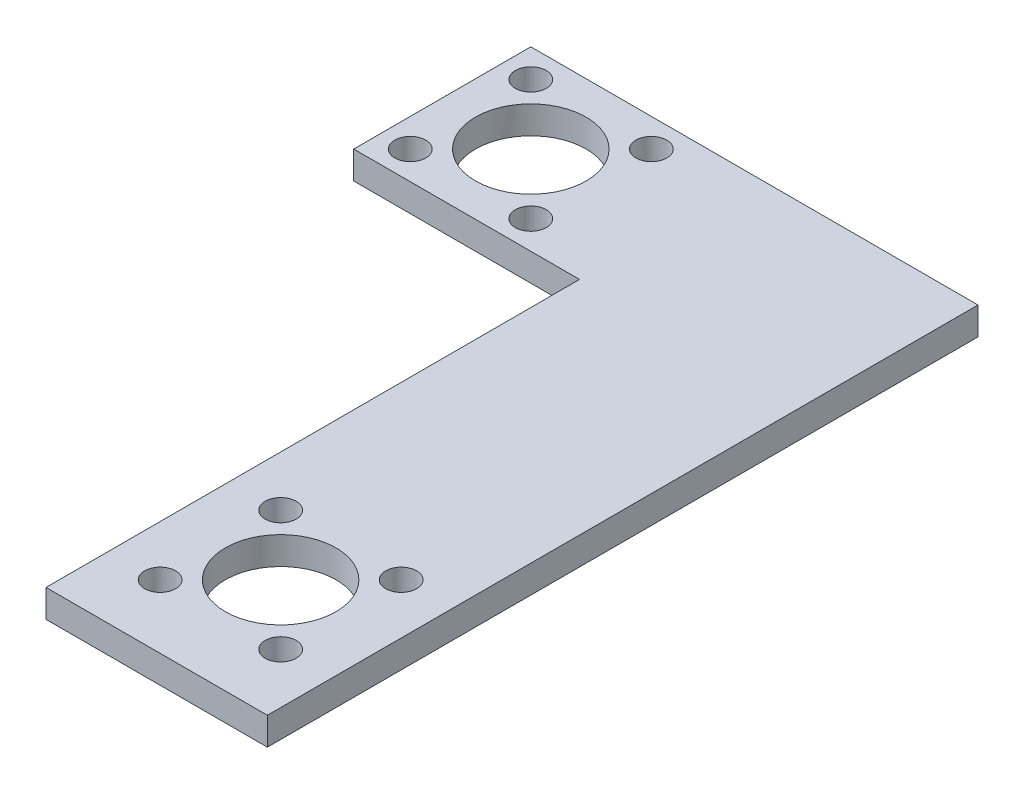
ISO-10303-21;
HEADER;
FILE_DESCRIPTION(('STEP AP214'),'2;1');
FILE_NAME('part.step','',(''),(''),'','','');
FILE_SCHEMA(('AUTOMOTIVE_DESIGN { 1 0 10303 214 1 1 1 1 }'));
ENDSEC;
DATA;
#1=APPLICATION_CONTEXT('core data for automotive mechanical design processes');
#2=APPLICATION_PROTOCOL_DEFINITION('international standard','automotive_design',2000,#1);
#3=PRODUCT_CONTEXT('',#1,'mechanical');
#4=PRODUCT('Part','Part','',(#3));
#5=PRODUCT_RELATED_PRODUCT_CATEGORY('part','',(#4));
#6=PRODUCT_DEFINITION_FORMATION('','',#4);
#7=PRODUCT_DEFINITION_CONTEXT('part definition',#1,'design');
#8=PRODUCT_DEFINITION('design','',#6,#7);
#9=PRODUCT_DEFINITION_SHAPE('','',#8);
#10=(LENGTH_UNIT() NAMED_UNIT(*) SI_UNIT(.MILLI.,.METRE.));
#11=(NAMED_UNIT(*) PLANE_ANGLE_UNIT() SI_UNIT($,.RADIAN.));
#12=(NAMED_UNIT(*) SI_UNIT($,.STERADIAN.) SOLID_ANGLE_UNIT());
#13=UNCERTAINTY_MEASURE_WITH_UNIT(LENGTH_MEASURE(1.E-05),#10,'distance_accuracy_value','');
#14=(GEOMETRIC_REPRESENTATION_CONTEXT(3) GLOBAL_UNCERTAINTY_ASSIGNED_CONTEXT((#13)) GLOBAL_UNIT_ASSIGNED_CONTEXT((#10,
#11,#12)) REPRESENTATION_CONTEXT('',''));
#15=CARTESIAN_POINT('',(0.,0.,0.));
#16=DIRECTION('',(0.,0.,1.));
#17=DIRECTION('',(1.,0.,0.));
#18=AXIS2_PLACEMENT_3D('',#15,#16,#17);
#19=CARTESIAN_POINT('',(0.,3.175,0.));
#20=DIRECTION('',(-1.,0.,0.));
#21=DIRECTION('',(0.,0.,1.));
#22=AXIS2_PLACEMENT_3D('',#19,#20,#21);
#23=PLANE('',#22);
#24=DIRECTION('',(0.,0.,-1.));
#25=VECTOR('',#24,1.);
#26=CARTESIAN_POINT('',(0.,0.,0.));
#27=LINE('',#26,#25);
#28=CARTESIAN_POINT('',(0.,0.,81.534));
#29=VERTEX_POINT('',#28);
#30=CARTESIAN_POINT('',(0.,0.,0.));
#31=VERTEX_POINT('',#30);
#32=EDGE_CURVE('E119',#29,#31,#27,.T.);
#33=ORIENTED_EDGE('',*,*,#32,.T.);
#34=DIRECTION('',(0.,-1.,0.));
#35=VECTOR('',#34,1.);
#36=CARTESIAN_POINT('',(0.,3.175,0.));
#37=LINE('',#36,#35);
#38=CARTESIAN_POINT('',(0.,3.175,0.));
#39=VERTEX_POINT('',#38);
#40=EDGE_CURVE('E11',#39,#31,#37,.T.);
#41=ORIENTED_EDGE('',*,*,#40,.F.);
#42=DIRECTION('',(0.,0.,-1.));
#43=VECTOR('',#42,1.);
#44=CARTESIAN_POINT('',(0.,3.175,0.));
#45=LINE('',#44,#43);
#46=CARTESIAN_POINT('',(0.,3.175,81.534));
#47=VERTEX_POINT('',#46);
#48=EDGE_CURVE('E130',#47,#39,#45,.T.);
#49=ORIENTED_EDGE('',*,*,#48,.F.);
#50=DIRECTION('',(0.,-1.,0.));
#51=VECTOR('',#50,1.);
#52=CARTESIAN_POINT('',(0.,3.175,81.534));
#53=LINE('',#52,#51);
#54=EDGE_CURVE('E115',#47,#29,#53,.T.);
#55=ORIENTED_EDGE('',*,*,#54,.T.);
#56=EDGE_LOOP('',(#33,#41,#49,#55));
#57=FACE_BOUND('',#56,.T.);
#58=ADVANCED_FACE('F35',(#57),#23,.F.);
#59=CARTESIAN_POINT('',(0.,3.175,0.));
#60=DIRECTION('',(0.,0.,1.));
#61=DIRECTION('',(1.,0.,0.));
#62=AXIS2_PLACEMENT_3D('',#59,#60,#61);
#63=PLANE('',#62);
#64=DIRECTION('',(-1.,0.,0.));
#65=VECTOR('',#64,1.);
#66=CARTESIAN_POINT('',(0.,0.,0.));
#67=LINE('',#66,#65);
#68=CARTESIAN_POINT('',(-51.308,0.,0.));
#69=VERTEX_POINT('',#68);
#70=EDGE_CURVE('E122',#31,#69,#67,.T.);
#71=ORIENTED_EDGE('',*,*,#70,.T.);
#72=DIRECTION('',(0.,-1.,0.));
#73=VECTOR('',#72,1.);
#74=CARTESIAN_POINT('',(-51.308,3.175,0.));
#75=LINE('',#74,#73);
#76=CARTESIAN_POINT('',(-51.308,3.175,0.));
#77=VERTEX_POINT('',#76);
#78=EDGE_CURVE('E43',#77,#69,#75,.T.);
#79=ORIENTED_EDGE('',*,*,#78,.F.);
#80=DIRECTION('',(-1.,0.,0.));
#81=VECTOR('',#80,1.);
#82=CARTESIAN_POINT('',(0.,3.175,0.));
#83=LINE('',#82,#81);
#84=EDGE_CURVE('E88',#39,#77,#83,.T.);
#85=ORIENTED_EDGE('',*,*,#84,.F.);
#86=ORIENTED_EDGE('',*,*,#40,.T.);
#87=EDGE_LOOP('',(#71,#79,#85,#86));
#88=FACE_BOUND('',#87,.T.);
#89=ADVANCED_FACE('F155',(#88),#63,.F.);
#90=CARTESIAN_POINT('',(-51.308,3.175,0.));
#91=DIRECTION('',(1.,0.,0.));
#92=DIRECTION('',(0.,0.,-1.));
#93=AXIS2_PLACEMENT_3D('',#90,#91,#92);
#94=PLANE('',#93);
#95=DIRECTION('',(0.,0.,1.));
#96=VECTOR('',#95,1.);
#97=CARTESIAN_POINT('',(-51.308,0.,0.));
#98=LINE('',#97,#96);
#99=CARTESIAN_POINT('',(-51.308,0.,20.32));
#100=VERTEX_POINT('',#99);
#101=EDGE_CURVE('E125',#69,#100,#98,.T.);
#102=ORIENTED_EDGE('',*,*,#101,.T.);
#103=DIRECTION('',(0.,-1.,0.));
#104=VECTOR('',#103,1.);
#105=CARTESIAN_POINT('',(-51.308,3.175,20.32));
#106=LINE('',#105,#104);
#107=CARTESIAN_POINT('',(-51.308,3.175,20.32));
#108=VERTEX_POINT('',#107);
#109=EDGE_CURVE('E110',#108,#100,#106,.T.);
#110=ORIENTED_EDGE('',*,*,#109,.F.);
#111=DIRECTION('',(0.,0.,1.));
#112=VECTOR('',#111,1.);
#113=CARTESIAN_POINT('',(-51.308,3.175,0.));
#114=LINE('',#113,#112);
#115=EDGE_CURVE('E101',#77,#108,#114,.T.);
#116=ORIENTED_EDGE('',*,*,#115,.F.);
#117=ORIENTED_EDGE('',*,*,#78,.T.);
#118=EDGE_LOOP('',(#102,#110,#116,#117));
#119=FACE_BOUND('',#118,.T.);
#120=ADVANCED_FACE('F136',(#119),#94,.F.);
#121=CARTESIAN_POINT('',(-51.308,3.175,20.32));
#122=DIRECTION('',(0.,0.,-1.));
#123=DIRECTION('',(-1.,0.,0.));
#124=AXIS2_PLACEMENT_3D('',#121,#122,#123);
#125=PLANE('',#124);
#126=DIRECTION('',(1.,0.,0.));
#127=VECTOR('',#126,1.);
#128=CARTESIAN_POINT('',(-51.308,0.,20.32));
#129=LINE('',#128,#127);
#130=CARTESIAN_POINT('',(-25.4,0.,20.32));
#131=VERTEX_POINT('',#130);
#132=EDGE_CURVE('E109',#100,#131,#129,.T.);
#133=ORIENTED_EDGE('',*,*,#132,.T.);
#134=DIRECTION('',(0.,-1.,0.));
#135=VECTOR('',#134,1.);
#136=CARTESIAN_POINT('',(-25.4,3.175,20.32));
#137=LINE('',#136,#135);
#138=CARTESIAN_POINT('',(-25.4,3.175,20.32));
#139=VERTEX_POINT('',#138);
#140=EDGE_CURVE('E106',#139,#131,#137,.T.);
#141=ORIENTED_EDGE('',*,*,#140,.F.);
#142=DIRECTION('',(1.,0.,0.));
#143=VECTOR('',#142,1.);
#144=CARTESIAN_POINT('',(-51.308,3.175,20.32));
#145=LINE('',#144,#143);
#146=EDGE_CURVE('E95',#108,#139,#145,.T.);
#147=ORIENTED_EDGE('',*,*,#146,.F.);
#148=ORIENTED_EDGE('',*,*,#109,.T.);
#149=EDGE_LOOP('',(#133,#141,#147,#148));
#150=FACE_BOUND('',#149,.T.);
#151=ADVANCED_FACE('F107',(#150),#125,.F.);
#152=CARTESIAN_POINT('',(-25.4,3.175,81.534));
#153=DIRECTION('',(1.,0.,0.));
#154=DIRECTION('',(0.,0.,-1.));
#155=AXIS2_PLACEMENT_3D('',#152,#153,#154);
#156=PLANE('',#155);
#157=DIRECTION('',(0.,0.,1.));
#158=VECTOR('',#157,1.);
#159=CARTESIAN_POINT('',(-25.4,0.,81.534));
#160=LINE('',#159,#158);
#161=CARTESIAN_POINT('',(-25.4,0.,81.534));
#162=VERTEX_POINT('',#161);
#163=EDGE_CURVE('E74',#131,#162,#160,.T.);
#164=ORIENTED_EDGE('',*,*,#163,.T.);
#165=DIRECTION('',(0.,-1.,0.));
#166=VECTOR('',#165,1.);
#167=CARTESIAN_POINT('',(-25.4,3.175,81.534));
#168=LINE('',#167,#166);
#169=CARTESIAN_POINT('',(-25.4,3.175,81.534));
#170=VERTEX_POINT('',#169);
#171=EDGE_CURVE('E111',#170,#162,#168,.T.);
#172=ORIENTED_EDGE('',*,*,#171,.F.);
#173=DIRECTION('',(0.,0.,1.));
#174=VECTOR('',#173,1.);
#175=CARTESIAN_POINT('',(-25.4,3.175,81.534));
#176=LINE('',#175,#174);
#177=EDGE_CURVE('E99',#139,#170,#176,.T.);
#178=ORIENTED_EDGE('',*,*,#177,.F.);
#179=ORIENTED_EDGE('',*,*,#140,.T.);
#180=EDGE_LOOP('',(#164,#172,#178,#179));
#181=FACE_BOUND('',#180,.T.);
#182=ADVANCED_FACE('F113',(#181),#156,.F.);
#183=CARTESIAN_POINT('',(0.,3.175,81.534));
#184=DIRECTION('',(0.,0.,-1.));
#185=DIRECTION('',(-1.,0.,0.));
#186=AXIS2_PLACEMENT_3D('',#183,#184,#185);
#187=PLANE('',#186);
#188=DIRECTION('',(1.,0.,0.));
#189=VECTOR('',#188,1.);
#190=CARTESIAN_POINT('',(0.,0.,81.534));
#191=LINE('',#190,#189);
#192=EDGE_CURVE('E80',#162,#29,#191,.T.);
#193=ORIENTED_EDGE('',*,*,#192,.T.);
#194=ORIENTED_EDGE('',*,*,#54,.F.);
#195=DIRECTION('',(1.,0.,0.));
#196=VECTOR('',#195,1.);
#197=CARTESIAN_POINT('',(0.,3.175,81.534));
#198=LINE('',#197,#196);
#199=EDGE_CURVE('E51',#170,#47,#198,.T.);
#200=ORIENTED_EDGE('',*,*,#199,.F.);
#201=ORIENTED_EDGE('',*,*,#171,.T.);
#202=EDGE_LOOP('',(#193,#194,#200,#201));
#203=FACE_BOUND('',#202,.T.);
#204=ADVANCED_FACE('F143',(#203),#187,.F.);
#205=CARTESIAN_POINT('',(0.,3.175,0.));
#206=DIRECTION('',(0.,-1.,0.));
#207=DIRECTION('',(0.,0.,-1.));
#208=AXIS2_PLACEMENT_3D('',#205,#206,#207);
#209=PLANE('',#208);
#210=CARTESIAN_POINT('',(-48.0627972132232,3.175,17.0747972132232));
#211=DIRECTION('',(0.,1.,0.));
#212=DIRECTION('',(0.,0.,1.));
#213=AXIS2_PLACEMENT_3D('',#210,#211,#212);
#214=CIRCLE('',#213,1.778);
#215=CARTESIAN_POINT('',(-48.0627972132232,3.175,18.8527972132233));
#216=VERTEX_POINT('',#215);
#217=EDGE_CURVE('E301',#216,#216,#214,.T.);
#218=ORIENTED_EDGE('',*,*,#217,.F.);
#219=EDGE_LOOP('',(#218));
#220=FACE_BOUND('',#219,.T.);
#221=CARTESIAN_POINT('',(-34.2332027867768,3.175,17.0747972132233));
#222=DIRECTION('',(0.,1.,0.));
#223=DIRECTION('',(0.,0.,1.));
#224=AXIS2_PLACEMENT_3D('',#221,#222,#223);
#225=CIRCLE('',#224,1.778);
#226=CARTESIAN_POINT('',(-34.2332027867768,3.175,18.8527972132233));
#227=VERTEX_POINT('',#226);
#228=EDGE_CURVE('E305',#227,#227,#225,.T.);
#229=ORIENTED_EDGE('',*,*,#228,.F.);
#230=EDGE_LOOP('',(#229));
#231=FACE_BOUND('',#230,.T.);
#232=CARTESIAN_POINT('',(-34.2332027867768,3.175,3.24520278677676));
#233=DIRECTION('',(0.,1.,0.));
#234=DIRECTION('',(0.,0.,1.));
#235=AXIS2_PLACEMENT_3D('',#232,#233,#234);
#236=CIRCLE('',#235,1.778);
#237=CARTESIAN_POINT('',(-34.2332027867768,3.175,5.02320278677676));
#238=VERTEX_POINT('',#237);
#239=EDGE_CURVE('E312',#238,#238,#236,.T.);
#240=ORIENTED_EDGE('',*,*,#239,.F.);
#241=EDGE_LOOP('',(#240));
#242=FACE_BOUND('',#241,.T.);
#243=CARTESIAN_POINT('',(-48.0627972132232,3.175,3.24520278677676));
#244=DIRECTION('',(0.,1.,0.));
#245=DIRECTION('',(0.,0.,1.));
#246=AXIS2_PLACEMENT_3D('',#243,#244,#245);
#247=CIRCLE('',#246,1.778);
#248=CARTESIAN_POINT('',(-48.0627972132232,3.175,5.02320278677676));
#249=VERTEX_POINT('',#248);
#250=EDGE_CURVE('E318',#249,#249,#247,.T.);
#251=ORIENTED_EDGE('',*,*,#250,.F.);
#252=EDGE_LOOP('',(#251));
#253=FACE_BOUND('',#252,.T.);
#254=CARTESIAN_POINT('',(-41.148,3.175,10.16));
#255=DIRECTION('',(0.,1.,0.));
#256=DIRECTION('',(0.,0.,1.));
#257=AXIS2_PLACEMENT_3D('',#254,#255,#256);
#258=CIRCLE('',#257,6.35);
#259=CARTESIAN_POINT('',(-41.148,3.175,16.51));
#260=VERTEX_POINT('',#259);
#261=EDGE_CURVE('E324',#260,#260,#258,.T.);
#262=ORIENTED_EDGE('',*,*,#261,.F.);
#263=EDGE_LOOP('',(#262));
#264=FACE_BOUND('',#263,.T.);
#265=CARTESIAN_POINT('',(-19.6147972132232,3.175,60.3952027867768));
#266=DIRECTION('',(0.,1.,0.));
#267=DIRECTION('',(0.,0.,1.));
#268=AXIS2_PLACEMENT_3D('',#265,#266,#267);
#269=CIRCLE('',#268,1.778);
#270=CARTESIAN_POINT('',(-19.6147972132232,3.175,62.1732027867768));
#271=VERTEX_POINT('',#270);
#272=EDGE_CURVE('E327',#271,#271,#269,.T.);
#273=ORIENTED_EDGE('',*,*,#272,.F.);
#274=EDGE_LOOP('',(#273));
#275=FACE_BOUND('',#274,.T.);
#276=CARTESIAN_POINT('',(-19.6147972132232,3.175,74.2247972132232));
#277=DIRECTION('',(0.,1.,0.));
#278=DIRECTION('',(0.,0.,1.));
#279=AXIS2_PLACEMENT_3D('',#276,#277,#278);
#280=CIRCLE('',#279,1.778);
#281=CARTESIAN_POINT('',(-19.6147972132232,3.175,76.0027972132232));
#282=VERTEX_POINT('',#281);
#283=EDGE_CURVE('E333',#282,#282,#280,.T.);
#284=ORIENTED_EDGE('',*,*,#283,.F.);
#285=EDGE_LOOP('',(#284));
#286=FACE_BOUND('',#285,.T.);
#287=CARTESIAN_POINT('',(-5.78520278677674,3.175,74.2247972132232));
#288=DIRECTION('',(0.,1.,0.));
#289=DIRECTION('',(0.,0.,1.));
#290=AXIS2_PLACEMENT_3D('',#287,#288,#289);
#291=CIRCLE('',#290,1.778);
#292=CARTESIAN_POINT('',(-5.78520278677674,3.175,76.0027972132232));
#293=VERTEX_POINT('',#292);
#294=EDGE_CURVE('E339',#293,#293,#291,.T.);
#295=ORIENTED_EDGE('',*,*,#294,.F.);
#296=EDGE_LOOP('',(#295));
#297=FACE_BOUND('',#296,.T.);
#298=CARTESIAN_POINT('',(-5.78520278677674,3.175,60.3952027867767));
#299=DIRECTION('',(0.,1.,0.));
#300=DIRECTION('',(0.,0.,1.));
#301=AXIS2_PLACEMENT_3D('',#298,#299,#300);
#302=CIRCLE('',#301,1.778);
#303=CARTESIAN_POINT('',(-5.78520278677674,3.175,62.1732027867767));
#304=VERTEX_POINT('',#303);
#305=EDGE_CURVE('E345',#304,#304,#302,.T.);
#306=ORIENTED_EDGE('',*,*,#305,.F.);
#307=EDGE_LOOP('',(#306));
#308=FACE_BOUND('',#307,.T.);
#309=CARTESIAN_POINT('',(-12.7,3.175,67.31));
#310=DIRECTION('',(0.,1.,0.));
#311=DIRECTION('',(0.,0.,1.));
#312=AXIS2_PLACEMENT_3D('',#309,#310,#311);
#313=CIRCLE('',#312,6.35);
#314=CARTESIAN_POINT('',(-12.7,3.175,73.66));
#315=VERTEX_POINT('',#314);
#316=EDGE_CURVE('E351',#315,#315,#313,.T.);
#317=ORIENTED_EDGE('',*,*,#316,.F.);
#318=EDGE_LOOP('',(#317));
#319=FACE_BOUND('',#318,.T.);
#320=ORIENTED_EDGE('',*,*,#48,.T.);
#321=ORIENTED_EDGE('',*,*,#84,.T.);
#322=ORIENTED_EDGE('',*,*,#115,.T.);
#323=ORIENTED_EDGE('',*,*,#146,.T.);
#324=ORIENTED_EDGE('',*,*,#177,.T.);
#325=ORIENTED_EDGE('',*,*,#199,.T.);
#326=EDGE_LOOP('',(#320,#321,#322,#323,#324,#325));
#327=FACE_BOUND('',#326,.T.);
#328=ADVANCED_FACE('F97',(#220,#231,#242,#253,#264,#275,#286,#297,#308,#319,#327),#209,.F.);
#329=CARTESIAN_POINT('',(0.,0.,0.));
#330=DIRECTION('',(0.,-1.,0.));
#331=DIRECTION('',(0.,0.,-1.));
#332=AXIS2_PLACEMENT_3D('',#329,#330,#331);
#333=PLANE('',#332);
#334=CARTESIAN_POINT('',(-48.0627972132232,0.,17.0747972132232));
#335=DIRECTION('',(0.,-1.,0.));
#336=DIRECTION('',(0.,0.,-1.));
#337=AXIS2_PLACEMENT_3D('',#334,#335,#336);
#338=CIRCLE('',#337,1.778);
#339=CARTESIAN_POINT('',(-48.0627972132232,0.,15.2967972132233));
#340=VERTEX_POINT('',#339);
#341=EDGE_CURVE('E298',#340,#340,#338,.F.);
#342=ORIENTED_EDGE('',*,*,#341,.T.);
#343=EDGE_LOOP('',(#342));
#344=FACE_BOUND('',#343,.T.);
#345=CARTESIAN_POINT('',(-34.2332027867768,0.,17.0747972132233));
#346=DIRECTION('',(0.,-1.,0.));
#347=DIRECTION('',(0.,0.,-1.));
#348=AXIS2_PLACEMENT_3D('',#345,#346,#347);
#349=CIRCLE('',#348,1.778);
#350=CARTESIAN_POINT('',(-34.2332027867768,0.,15.2967972132233));
#351=VERTEX_POINT('',#350);
#352=EDGE_CURVE('E302',#351,#351,#349,.F.);
#353=ORIENTED_EDGE('',*,*,#352,.T.);
#354=EDGE_LOOP('',(#353));
#355=FACE_BOUND('',#354,.T.);
#356=CARTESIAN_POINT('',(-34.2332027867768,0.,3.24520278677676));
#357=DIRECTION('',(0.,-1.,0.));
#358=DIRECTION('',(0.,0.,-1.));
#359=AXIS2_PLACEMENT_3D('',#356,#357,#358);
#360=CIRCLE('',#359,1.778);
#361=CARTESIAN_POINT('',(-34.2332027867768,0.,1.46720278677676));
#362=VERTEX_POINT('',#361);
#363=EDGE_CURVE('E310',#362,#362,#360,.F.);
#364=ORIENTED_EDGE('',*,*,#363,.T.);
#365=EDGE_LOOP('',(#364));
#366=FACE_BOUND('',#365,.T.);
#367=CARTESIAN_POINT('',(-48.0627972132232,0.,3.24520278677676));
#368=DIRECTION('',(0.,-1.,0.));
#369=DIRECTION('',(0.,0.,-1.));
#370=AXIS2_PLACEMENT_3D('',#367,#368,#369);
#371=CIRCLE('',#370,1.778);
#372=CARTESIAN_POINT('',(-48.0627972132232,0.,1.46720278677676));
#373=VERTEX_POINT('',#372);
#374=EDGE_CURVE('E315',#373,#373,#371,.F.);
#375=ORIENTED_EDGE('',*,*,#374,.T.);
#376=EDGE_LOOP('',(#375));
#377=FACE_BOUND('',#376,.T.);
#378=CARTESIAN_POINT('',(-41.148,0.,10.16));
#379=DIRECTION('',(0.,-1.,0.));
#380=DIRECTION('',(0.,0.,-1.));
#381=AXIS2_PLACEMENT_3D('',#378,#379,#380);
#382=CIRCLE('',#381,6.35);
#383=CARTESIAN_POINT('',(-41.148,0.,3.81000000000001));
#384=VERTEX_POINT('',#383);
#385=EDGE_CURVE('E321',#384,#384,#382,.F.);
#386=ORIENTED_EDGE('',*,*,#385,.T.);
#387=EDGE_LOOP('',(#386));
#388=FACE_BOUND('',#387,.T.);
#389=CARTESIAN_POINT('',(-19.6147972132232,0.,60.3952027867768));
#390=DIRECTION('',(0.,1.,0.));
#391=DIRECTION('',(0.,0.,1.));
#392=AXIS2_PLACEMENT_3D('',#389,#390,#391);
#393=CIRCLE('',#392,1.778);
#394=CARTESIAN_POINT('',(-19.6147972132232,0.,62.1732027867768));
#395=VERTEX_POINT('',#394);
#396=EDGE_CURVE('E330',#395,#395,#393,.T.);
#397=ORIENTED_EDGE('',*,*,#396,.T.);
#398=EDGE_LOOP('',(#397));
#399=FACE_BOUND('',#398,.T.);
#400=CARTESIAN_POINT('',(-19.6147972132232,0.,74.2247972132232));
#401=DIRECTION('',(0.,1.,0.));
#402=DIRECTION('',(0.,0.,1.));
#403=AXIS2_PLACEMENT_3D('',#400,#401,#402);
#404=CIRCLE('',#403,1.778);
#405=CARTESIAN_POINT('',(-19.6147972132232,0.,76.0027972132232));
#406=VERTEX_POINT('',#405);
#407=EDGE_CURVE('E336',#406,#406,#404,.T.);
#408=ORIENTED_EDGE('',*,*,#407,.T.);
#409=EDGE_LOOP('',(#408));
#410=FACE_BOUND('',#409,.T.);
#411=CARTESIAN_POINT('',(-5.78520278677674,0.,74.2247972132232));
#412=DIRECTION('',(0.,1.,0.));
#413=DIRECTION('',(0.,0.,1.));
#414=AXIS2_PLACEMENT_3D('',#411,#412,#413);
#415=CIRCLE('',#414,1.778);
#416=CARTESIAN_POINT('',(-5.78520278677674,0.,76.0027972132232));
#417=VERTEX_POINT('',#416);
#418=EDGE_CURVE('E342',#417,#417,#415,.T.);
#419=ORIENTED_EDGE('',*,*,#418,.T.);
#420=EDGE_LOOP('',(#419));
#421=FACE_BOUND('',#420,.T.);
#422=CARTESIAN_POINT('',(-5.78520278677674,0.,60.3952027867767));
#423=DIRECTION('',(0.,1.,0.));
#424=DIRECTION('',(0.,0.,1.));
#425=AXIS2_PLACEMENT_3D('',#422,#423,#424);
#426=CIRCLE('',#425,1.778);
#427=CARTESIAN_POINT('',(-5.78520278677674,0.,62.1732027867767));
#428=VERTEX_POINT('',#427);
#429=EDGE_CURVE('E348',#428,#428,#426,.T.);
#430=ORIENTED_EDGE('',*,*,#429,.T.);
#431=EDGE_LOOP('',(#430));
#432=FACE_BOUND('',#431,.T.);
#433=CARTESIAN_POINT('',(-12.7,0.,67.31));
#434=DIRECTION('',(0.,1.,0.));
#435=DIRECTION('',(0.,0.,1.));
#436=AXIS2_PLACEMENT_3D('',#433,#434,#435);
#437=CIRCLE('',#436,6.35);
#438=CARTESIAN_POINT('',(-12.7,0.,73.66));
#439=VERTEX_POINT('',#438);
#440=EDGE_CURVE('E123',#439,#439,#437,.T.);
#441=ORIENTED_EDGE('',*,*,#440,.T.);
#442=EDGE_LOOP('',(#441));
#443=FACE_BOUND('',#442,.T.);
#444=ORIENTED_EDGE('',*,*,#32,.F.);
#445=ORIENTED_EDGE('',*,*,#192,.F.);
#446=ORIENTED_EDGE('',*,*,#163,.F.);
#447=ORIENTED_EDGE('',*,*,#132,.F.);
#448=ORIENTED_EDGE('',*,*,#101,.F.);
#449=ORIENTED_EDGE('',*,*,#70,.F.);
#450=EDGE_LOOP('',(#444,#445,#446,#447,#448,#449));
#451=FACE_BOUND('',#450,.T.);
#452=ADVANCED_FACE('F139',(#344,#355,#366,#377,#388,#399,#410,#421,#432,#443,#451),#333,.T.);
#453=CARTESIAN_POINT('',(-12.7,0.,67.31));
#454=DIRECTION('',(0.,1.,0.));
#455=DIRECTION('',(0.,0.,1.));
#456=AXIS2_PLACEMENT_3D('',#453,#454,#455);
#457=CYLINDRICAL_SURFACE('',#456,6.35);
#458=ORIENTED_EDGE('',*,*,#440,.F.);
#459=EDGE_LOOP('',(#458));
#460=FACE_BOUND('',#459,.T.);
#461=ORIENTED_EDGE('',*,*,#316,.T.);
#462=EDGE_LOOP('',(#461));
#463=FACE_BOUND('',#462,.T.);
#464=ADVANCED_FACE('F183',(#460,#463),#457,.F.);
#465=CARTESIAN_POINT('',(-5.78520278677674,0.,60.3952027867767));
#466=DIRECTION('',(0.,1.,0.));
#467=DIRECTION('',(0.,0.,1.));
#468=AXIS2_PLACEMENT_3D('',#465,#466,#467);
#469=CYLINDRICAL_SURFACE('',#468,1.778);
#470=ORIENTED_EDGE('',*,*,#429,.F.);
#471=EDGE_LOOP('',(#470));
#472=FACE_BOUND('',#471,.T.);
#473=ORIENTED_EDGE('',*,*,#305,.T.);
#474=EDGE_LOOP('',(#473));
#475=FACE_BOUND('',#474,.T.);
#476=ADVANCED_FACE('F188',(#472,#475),#469,.F.);
#477=CARTESIAN_POINT('',(-5.78520278677674,0.,74.2247972132232));
#478=DIRECTION('',(0.,1.,0.));
#479=DIRECTION('',(0.,0.,1.));
#480=AXIS2_PLACEMENT_3D('',#477,#478,#479);
#481=CYLINDRICAL_SURFACE('',#480,1.778);
#482=ORIENTED_EDGE('',*,*,#418,.F.);
#483=EDGE_LOOP('',(#482));
#484=FACE_BOUND('',#483,.T.);
#485=ORIENTED_EDGE('',*,*,#294,.T.);
#486=EDGE_LOOP('',(#485));
#487=FACE_BOUND('',#486,.T.);
#488=ADVANCED_FACE('F200',(#484,#487),#481,.F.);
#489=CARTESIAN_POINT('',(-19.6147972132232,0.,74.2247972132232));
#490=DIRECTION('',(0.,1.,0.));
#491=DIRECTION('',(0.,0.,1.));
#492=AXIS2_PLACEMENT_3D('',#489,#490,#491);
#493=CYLINDRICAL_SURFACE('',#492,1.778);
#494=ORIENTED_EDGE('',*,*,#407,.F.);
#495=EDGE_LOOP('',(#494));
#496=FACE_BOUND('',#495,.T.);
#497=ORIENTED_EDGE('',*,*,#283,.T.);
#498=EDGE_LOOP('',(#497));
#499=FACE_BOUND('',#498,.T.);
#500=ADVANCED_FACE('F210',(#496,#499),#493,.F.);
#501=CARTESIAN_POINT('',(-19.6147972132232,0.,60.3952027867768));
#502=DIRECTION('',(0.,1.,0.));
#503=DIRECTION('',(0.,0.,1.));
#504=AXIS2_PLACEMENT_3D('',#501,#502,#503);
#505=CYLINDRICAL_SURFACE('',#504,1.778);
#506=ORIENTED_EDGE('',*,*,#396,.F.);
#507=EDGE_LOOP('',(#506));
#508=FACE_BOUND('',#507,.T.);
#509=ORIENTED_EDGE('',*,*,#272,.T.);
#510=EDGE_LOOP('',(#509));
#511=FACE_BOUND('',#510,.T.);
#512=ADVANCED_FACE('F220',(#508,#511),#505,.F.);
#513=CARTESIAN_POINT('',(-41.148,-0.00100000000000013,10.16));
#514=DIRECTION('',(0.,1.,0.));
#515=DIRECTION('',(0.,0.,1.));
#516=AXIS2_PLACEMENT_3D('',#513,#514,#515);
#517=CYLINDRICAL_SURFACE('',#516,6.35);
#518=ORIENTED_EDGE('',*,*,#385,.F.);
#519=EDGE_LOOP('',(#518));
#520=FACE_BOUND('',#519,.T.);
#521=ORIENTED_EDGE('',*,*,#261,.T.);
#522=EDGE_LOOP('',(#521));
#523=FACE_BOUND('',#522,.T.);
#524=ADVANCED_FACE('F230',(#520,#523),#517,.F.);
#525=CARTESIAN_POINT('',(-48.0627972132232,-0.00100000000000013,3.24520278677676));
#526=DIRECTION('',(0.,1.,0.));
#527=DIRECTION('',(0.,0.,1.));
#528=AXIS2_PLACEMENT_3D('',#525,#526,#527);
#529=CYLINDRICAL_SURFACE('',#528,1.778);
#530=ORIENTED_EDGE('',*,*,#374,.F.);
#531=EDGE_LOOP('',(#530));
#532=FACE_BOUND('',#531,.T.);
#533=ORIENTED_EDGE('',*,*,#250,.T.);
#534=EDGE_LOOP('',(#533));
#535=FACE_BOUND('',#534,.T.);
#536=ADVANCED_FACE('F251',(#532,#535),#529,.F.);
#537=CARTESIAN_POINT('',(-34.2332027867768,-0.00100000000000013,3.24520278677676));
#538=DIRECTION('',(0.,1.,0.));
#539=DIRECTION('',(0.,0.,1.));
#540=AXIS2_PLACEMENT_3D('',#537,#538,#539);
#541=CYLINDRICAL_SURFACE('',#540,1.778);
#542=ORIENTED_EDGE('',*,*,#363,.F.);
#543=EDGE_LOOP('',(#542));
#544=FACE_BOUND('',#543,.T.);
#545=ORIENTED_EDGE('',*,*,#239,.T.);
#546=EDGE_LOOP('',(#545));
#547=FACE_BOUND('',#546,.T.);
#548=ADVANCED_FACE('F261',(#544,#547),#541,.F.);
#549=CARTESIAN_POINT('',(-34.2332027867768,-0.00100000000000013,17.0747972132233));
#550=DIRECTION('',(0.,1.,0.));
#551=DIRECTION('',(0.,0.,1.));
#552=AXIS2_PLACEMENT_3D('',#549,#550,#551);
#553=CYLINDRICAL_SURFACE('',#552,1.778);
#554=ORIENTED_EDGE('',*,*,#352,.F.);
#555=EDGE_LOOP('',(#554));
#556=FACE_BOUND('',#555,.T.);
#557=ORIENTED_EDGE('',*,*,#228,.T.);
#558=EDGE_LOOP('',(#557));
#559=FACE_BOUND('',#558,.T.);
#560=ADVANCED_FACE('F271',(#556,#559),#553,.F.);
#561=CARTESIAN_POINT('',(-48.0627972132232,-0.00100000000000013,17.0747972132232));
#562=DIRECTION('',(0.,1.,0.));
#563=DIRECTION('',(0.,0.,1.));
#564=AXIS2_PLACEMENT_3D('',#561,#562,#563);
#565=CYLINDRICAL_SURFACE('',#564,1.778);
#566=ORIENTED_EDGE('',*,*,#341,.F.);
#567=EDGE_LOOP('',(#566));
#568=FACE_BOUND('',#567,.T.);
#569=ORIENTED_EDGE('',*,*,#217,.T.);
#570=EDGE_LOOP('',(#569));
#571=FACE_BOUND('',#570,.T.);
#572=ADVANCED_FACE('F281',(#568,#571),#565,.F.);
#573=CLOSED_SHELL('',(#58,#89,#120,#151,#182,#204,#328,#452,#464,#476,#488,#500,#512,#524,#536,
#548,#560,#572));
#574=MANIFOLD_SOLID_BREP('B2',#573);
#575=ADVANCED_BREP_SHAPE_REPRESENTATION('',(#18,#574),#14);
#576=SHAPE_DEFINITION_REPRESENTATION(#9,#575);
ENDSEC;
END-ISO-10303-21;
